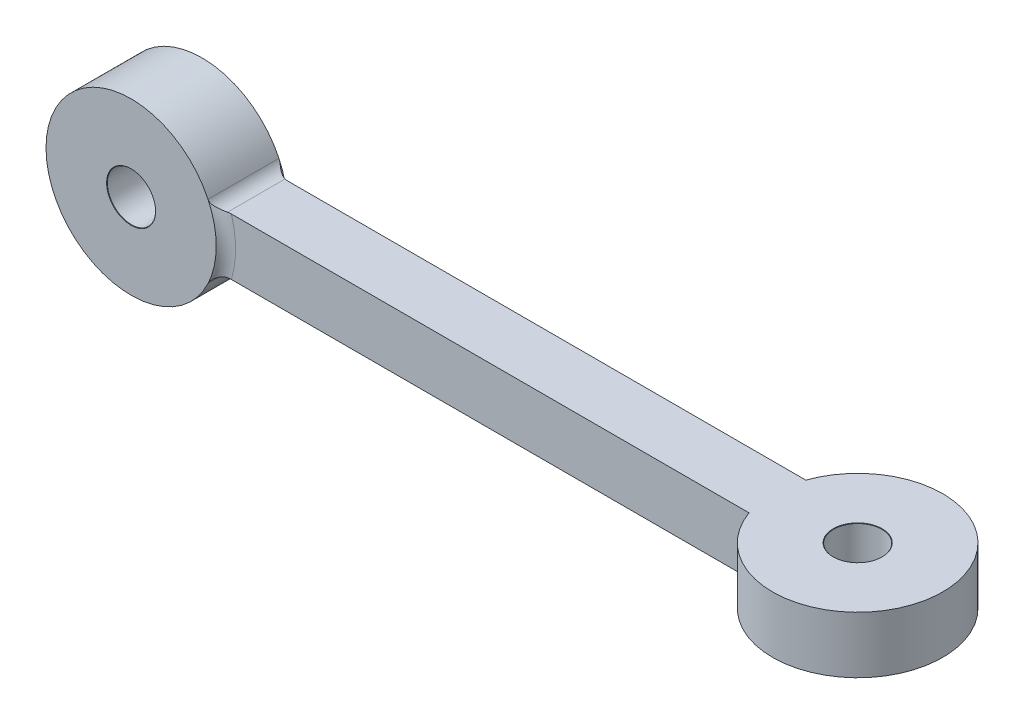
ISO-10303-21;
HEADER;
FILE_DESCRIPTION(('STEP AP214'),'2;1');
FILE_NAME('part.step','',(''),(''),'','','');
FILE_SCHEMA(('AUTOMOTIVE_DESIGN { 1 0 10303 214 1 1 1 1 }'));
ENDSEC;
DATA;
#1=APPLICATION_CONTEXT('core data for automotive mechanical design processes');
#2=APPLICATION_PROTOCOL_DEFINITION('international standard','automotive_design',2000,#1);
#3=PRODUCT_CONTEXT('',#1,'mechanical');
#4=PRODUCT('Part','Part','',(#3));
#5=PRODUCT_RELATED_PRODUCT_CATEGORY('part','',(#4));
#6=PRODUCT_DEFINITION_FORMATION('','',#4);
#7=PRODUCT_DEFINITION_CONTEXT('part definition',#1,'design');
#8=PRODUCT_DEFINITION('design','',#6,#7);
#9=PRODUCT_DEFINITION_SHAPE('','',#8);
#10=(LENGTH_UNIT() NAMED_UNIT(*) SI_UNIT(.MILLI.,.METRE.));
#11=(NAMED_UNIT(*) PLANE_ANGLE_UNIT() SI_UNIT($,.RADIAN.));
#12=(NAMED_UNIT(*) SI_UNIT($,.STERADIAN.) SOLID_ANGLE_UNIT());
#13=UNCERTAINTY_MEASURE_WITH_UNIT(LENGTH_MEASURE(1.E-05),#10,'distance_accuracy_value','');
#14=(GEOMETRIC_REPRESENTATION_CONTEXT(3) GLOBAL_UNCERTAINTY_ASSIGNED_CONTEXT((#13)) GLOBAL_UNIT_ASSIGNED_CONTEXT((#10,
#11,#12)) REPRESENTATION_CONTEXT('',''));
#15=CARTESIAN_POINT('',(0.,0.,0.));
#16=DIRECTION('',(0.,0.,1.));
#17=DIRECTION('',(1.,0.,0.));
#18=AXIS2_PLACEMENT_3D('',#15,#16,#17);
#19=CARTESIAN_POINT('',(-3.,0.,-4.5));
#20=DIRECTION('',(0.,0.,1.));
#21=DIRECTION('',(1.,0.,0.));
#22=AXIS2_PLACEMENT_3D('',#19,#20,#21);
#23=CYLINDRICAL_SURFACE('',#22,6.);
#24=CARTESIAN_POINT('',(-3.,0.,-4.5));
#25=DIRECTION('',(0.,0.,1.));
#26=DIRECTION('',(1.,0.,0.));
#27=AXIS2_PLACEMENT_3D('',#24,#25,#26);
#28=CIRCLE('',#27,6.);
#29=CARTESIAN_POINT('',(2.42104741743151,2.57142857142857,-4.5));
#30=VERTEX_POINT('',#29);
#31=CARTESIAN_POINT('',(2.42104741743151,-2.57142857142857,-4.5));
#32=VERTEX_POINT('',#31);
#33=EDGE_CURVE('E149',#30,#32,#28,.T.);
#34=ORIENTED_EDGE('',*,*,#33,.T.);
#35=DIRECTION('',(0.,0.,1.));
#36=VECTOR('',#35,1.);
#37=CARTESIAN_POINT('',(2.42104741743151,-2.57142857142857,-4.5));
#38=LINE('',#37,#36);
#39=CARTESIAN_POINT('',(2.42104741743151,-2.57142857142857,0.5));
#40=VERTEX_POINT('',#39);
#41=EDGE_CURVE('E154',#32,#40,#38,.T.);
#42=ORIENTED_EDGE('',*,*,#41,.T.);
#43=CARTESIAN_POINT('',(-3.,0.,0.5));
#44=DIRECTION('',(0.,0.,1.));
#45=DIRECTION('',(1.,0.,0.));
#46=AXIS2_PLACEMENT_3D('',#43,#44,#45);
#47=CIRCLE('',#46,6.);
#48=CARTESIAN_POINT('',(2.42104741743151,2.57142857142857,0.5));
#49=VERTEX_POINT('',#48);
#50=EDGE_CURVE('E145',#49,#40,#47,.T.);
#51=ORIENTED_EDGE('',*,*,#50,.F.);
#52=DIRECTION('',(0.,0.,1.));
#53=VECTOR('',#52,1.);
#54=CARTESIAN_POINT('',(2.42104741743151,2.57142857142857,-4.5));
#55=LINE('',#54,#53);
#56=EDGE_CURVE('E152',#49,#30,#55,.F.);
#57=ORIENTED_EDGE('',*,*,#56,.T.);
#58=EDGE_LOOP('',(#34,#42,#51,#57));
#59=FACE_BOUND('',#58,.T.);
#60=ADVANCED_FACE('F39',(#59),#23,.T.);
#61=CARTESIAN_POINT('',(-3.,0.,-4.5));
#62=DIRECTION('',(0.,0.,1.));
#63=DIRECTION('',(1.,0.,0.));
#64=AXIS2_PLACEMENT_3D('',#61,#62,#63);
#65=PLANE('',#64);
#66=CARTESIAN_POINT('',(-3.,0.,-4.5));
#67=DIRECTION('',(0.,0.,1.));
#68=DIRECTION('',(1.,0.,0.));
#69=AXIS2_PLACEMENT_3D('',#66,#67,#68);
#70=CIRCLE('',#69,1.7);
#71=CARTESIAN_POINT('',(-1.3,0.,-4.5));
#72=VERTEX_POINT('',#71);
#73=EDGE_CURVE('E208',#72,#72,#70,.T.);
#74=ORIENTED_EDGE('',*,*,#73,.T.);
#75=EDGE_LOOP('',(#74));
#76=FACE_BOUND('',#75,.T.);
#77=ORIENTED_EDGE('',*,*,#33,.F.);
#78=EDGE_CURVE('E148',#32,#30,#28,.T.);
#79=ORIENTED_EDGE('',*,*,#78,.F.);
#80=EDGE_LOOP('',(#77,#79));
#81=FACE_BOUND('',#80,.T.);
#82=ADVANCED_FACE('F241',(#76,#81),#65,.F.);
#83=CARTESIAN_POINT('',(-3.,0.,0.5));
#84=DIRECTION('',(0.,0.,1.));
#85=DIRECTION('',(1.,0.,0.));
#86=AXIS2_PLACEMENT_3D('',#83,#84,#85);
#87=PLANE('',#86);
#88=CARTESIAN_POINT('',(-3.,0.,0.5));
#89=DIRECTION('',(0.,0.,1.));
#90=DIRECTION('',(1.,0.,0.));
#91=AXIS2_PLACEMENT_3D('',#88,#89,#90);
#92=CIRCLE('',#91,1.725);
#93=CARTESIAN_POINT('',(-1.275,0.,0.5));
#94=VERTEX_POINT('',#93);
#95=EDGE_CURVE('E214',#94,#94,#92,.T.);
#96=ORIENTED_EDGE('',*,*,#95,.F.);
#97=EDGE_LOOP('',(#96));
#98=FACE_BOUND('',#97,.T.);
#99=ORIENTED_EDGE('',*,*,#50,.T.);
#100=EDGE_CURVE('E143',#40,#49,#47,.T.);
#101=ORIENTED_EDGE('',*,*,#100,.T.);
#102=EDGE_LOOP('',(#99,#101));
#103=FACE_BOUND('',#102,.T.);
#104=ADVANCED_FACE('F249',(#98,#103),#87,.T.);
#105=CARTESIAN_POINT('',(45.7195480052413,-2.,-2.));
#106=DIRECTION('',(0.,1.,0.));
#107=DIRECTION('',(0.,0.,1.));
#108=AXIS2_PLACEMENT_3D('',#105,#106,#107);
#109=CYLINDRICAL_SURFACE('',#108,6.);
#110=DIRECTION('',(0.,1.,0.));
#111=VECTOR('',#110,1.);
#112=CARTESIAN_POINT('',(40.0626937557489,-2.,-4.));
#113=LINE('',#112,#111);
#114=CARTESIAN_POINT('',(40.0626937557489,-2.,-4.));
#115=VERTEX_POINT('',#114);
#116=CARTESIAN_POINT('',(40.0626937557489,2.,-4.));
#117=VERTEX_POINT('',#116);
#118=EDGE_CURVE('E108',#115,#117,#113,.T.);
#119=ORIENTED_EDGE('',*,*,#118,.T.);
#120=CARTESIAN_POINT('',(45.7195480052413,2.,-2.));
#121=DIRECTION('',(0.,1.,0.));
#122=DIRECTION('',(0.,0.,1.));
#123=AXIS2_PLACEMENT_3D('',#120,#121,#122);
#124=CIRCLE('',#123,6.);
#125=CARTESIAN_POINT('',(40.0626937557489,2.,0.));
#126=VERTEX_POINT('',#125);
#127=EDGE_CURVE('E115',#126,#117,#124,.T.);
#128=ORIENTED_EDGE('',*,*,#127,.F.);
#129=DIRECTION('',(0.,1.,0.));
#130=VECTOR('',#129,1.);
#131=CARTESIAN_POINT('',(40.0626937557489,-2.,0.));
#132=LINE('',#131,#130);
#133=CARTESIAN_POINT('',(40.0626937557489,-2.,0.));
#134=VERTEX_POINT('',#133);
#135=EDGE_CURVE('E123',#134,#126,#132,.T.);
#136=ORIENTED_EDGE('',*,*,#135,.F.);
#137=CARTESIAN_POINT('',(45.7195480052413,-2.,-2.));
#138=DIRECTION('',(0.,1.,0.));
#139=DIRECTION('',(0.,0.,1.));
#140=AXIS2_PLACEMENT_3D('',#137,#138,#139);
#141=CIRCLE('',#140,6.);
#142=EDGE_CURVE('E122',#134,#115,#141,.T.);
#143=ORIENTED_EDGE('',*,*,#142,.T.);
#144=EDGE_LOOP('',(#119,#128,#136,#143));
#145=FACE_BOUND('',#144,.T.);
#146=ADVANCED_FACE('F119',(#145),#109,.T.);
#147=CARTESIAN_POINT('',(0.,-2.,0.));
#148=DIRECTION('',(0.,0.,1.));
#149=DIRECTION('',(1.,0.,0.));
#150=AXIS2_PLACEMENT_3D('',#147,#148,#149);
#151=PLANE('',#150);
#152=DIRECTION('',(1.,0.,0.));
#153=VECTOR('',#152,1.);
#154=CARTESIAN_POINT('',(0.,2.,0.));
#155=LINE('',#154,#153);
#156=CARTESIAN_POINT('',(3.56828020454466,2.,0.));
#157=VERTEX_POINT('',#156);
#158=EDGE_CURVE('E114',#157,#126,#155,.T.);
#159=ORIENTED_EDGE('',*,*,#158,.F.);
#160=CARTESIAN_POINT('',(-3.,0.,0.));
#161=DIRECTION('',(0.,0.,1.));
#162=DIRECTION('',(1.,0.,0.));
#163=AXIS2_PLACEMENT_3D('',#160,#161,#162);
#164=CIRCLE('',#163,6.86602540378444);
#165=CARTESIAN_POINT('',(3.56828020454466,-2.,0.));
#166=VERTEX_POINT('',#165);
#167=EDGE_CURVE('E161',#157,#166,#164,.F.);
#168=ORIENTED_EDGE('',*,*,#167,.T.);
#169=DIRECTION('',(1.,0.,0.));
#170=VECTOR('',#169,1.);
#171=CARTESIAN_POINT('',(0.,-2.,0.));
#172=LINE('',#171,#170);
#173=EDGE_CURVE('E124',#166,#134,#172,.T.);
#174=ORIENTED_EDGE('',*,*,#173,.T.);
#175=ORIENTED_EDGE('',*,*,#135,.T.);
#176=EDGE_LOOP('',(#159,#168,#174,#175));
#177=FACE_BOUND('',#176,.T.);
#178=ADVANCED_FACE('F289',(#177),#151,.T.);
#179=CARTESIAN_POINT('',(0.,-2.,-4.));
#180=DIRECTION('',(0.,0.,1.));
#181=DIRECTION('',(1.,0.,0.));
#182=AXIS2_PLACEMENT_3D('',#179,#180,#181);
#183=PLANE('',#182);
#184=DIRECTION('',(1.,0.,0.));
#185=VECTOR('',#184,1.);
#186=CARTESIAN_POINT('',(0.,-2.,-4.));
#187=LINE('',#186,#185);
#188=CARTESIAN_POINT('',(3.56828020454466,-2.,-4.));
#189=VERTEX_POINT('',#188);
#190=EDGE_CURVE('E140',#189,#115,#187,.T.);
#191=ORIENTED_EDGE('',*,*,#190,.F.);
#192=CARTESIAN_POINT('',(-3.,0.,-4.));
#193=DIRECTION('',(0.,0.,1.));
#194=DIRECTION('',(1.,0.,0.));
#195=AXIS2_PLACEMENT_3D('',#192,#193,#194);
#196=CIRCLE('',#195,6.86602540378444);
#197=CARTESIAN_POINT('',(3.56828020454466,2.,-4.));
#198=VERTEX_POINT('',#197);
#199=EDGE_CURVE('E111',#189,#198,#196,.T.);
#200=ORIENTED_EDGE('',*,*,#199,.T.);
#201=DIRECTION('',(1.,0.,0.));
#202=VECTOR('',#201,1.);
#203=CARTESIAN_POINT('',(0.,2.,-4.));
#204=LINE('',#203,#202);
#205=EDGE_CURVE('E104',#198,#117,#204,.T.);
#206=ORIENTED_EDGE('',*,*,#205,.T.);
#207=ORIENTED_EDGE('',*,*,#118,.F.);
#208=EDGE_LOOP('',(#191,#200,#206,#207));
#209=FACE_BOUND('',#208,.T.);
#210=ADVANCED_FACE('F107',(#209),#183,.F.);
#211=CARTESIAN_POINT('',(0.,-2.,0.));
#212=DIRECTION('',(0.,1.,0.));
#213=DIRECTION('',(0.,0.,1.));
#214=AXIS2_PLACEMENT_3D('',#211,#212,#213);
#215=PLANE('',#214);
#216=CARTESIAN_POINT('',(45.7195480052413,-2.,-2.));
#217=DIRECTION('',(0.,1.,0.));
#218=DIRECTION('',(0.,0.,1.));
#219=AXIS2_PLACEMENT_3D('',#216,#217,#218);
#220=CIRCLE('',#219,1.69999999999999);
#221=CARTESIAN_POINT('',(45.7195480052413,-2.,-0.300000000000007));
#222=VERTEX_POINT('',#221);
#223=EDGE_CURVE('E44',#222,#222,#220,.T.);
#224=ORIENTED_EDGE('',*,*,#223,.T.);
#225=EDGE_LOOP('',(#224));
#226=FACE_BOUND('',#225,.T.);
#227=ORIENTED_EDGE('',*,*,#173,.F.);
#228=CARTESIAN_POINT('',(3.56828020454466,-2.,0.));
#229=CARTESIAN_POINT('',(3.52714517806251,-2.,1.7825944556333E-05));
#230=CARTESIAN_POINT('',(3.48626715233828,-2.,0.00231589468487027));
#231=CARTESIAN_POINT('',(3.40502552967545,-2.,0.0114724696003244));
#232=CARTESIAN_POINT('',(3.36466192733037,-2.,0.018330927806529));
#233=CARTESIAN_POINT('',(3.32455532033676,-2.,0.0274695808395556));
#234=B_SPLINE_CURVE_WITH_KNOTS('',3,(#228,#229,#230,#231,#232,#233),.UNSPECIFIED.,.F.,.F.,(4,2,
4),(0.,0.122827712522096,0.245654133088434),.UNSPECIFIED.);
#235=CARTESIAN_POINT('',(3.32455532033676,-2.,0.0274695808395556));
#236=VERTEX_POINT('',#235);
#237=EDGE_CURVE('E49',#166,#236,#234,.T.);
#238=ORIENTED_EDGE('',*,*,#237,.T.);
#239=DIRECTION('',(0.,0.,1.));
#240=VECTOR('',#239,1.);
#241=CARTESIAN_POINT('',(3.32455532033676,-2.,0.));
#242=LINE('',#241,#240);
#243=CARTESIAN_POINT('',(3.32455532033676,-2.,-4.02746958083956));
#244=VERTEX_POINT('',#243);
#245=EDGE_CURVE('E157',#236,#244,#242,.F.);
#246=ORIENTED_EDGE('',*,*,#245,.T.);
#247=CARTESIAN_POINT('',(3.32455532033676,-2.,-4.02746958083956));
#248=CARTESIAN_POINT('',(3.36466192733037,-2.,-4.01833092780653));
#249=CARTESIAN_POINT('',(3.40502552967545,-2.,-4.01147246960032));
#250=CARTESIAN_POINT('',(3.48626715233828,-2.,-4.00231589468487));
#251=CARTESIAN_POINT('',(3.52714517806251,-2.,-4.00001782594456));
#252=CARTESIAN_POINT('',(3.56828020454466,-2.,-4.));
#253=B_SPLINE_CURVE_WITH_KNOTS('',3,(#247,#248,#249,#250,#251,#252),.UNSPECIFIED.,.F.,.F.,(4,2,
4),(0.,0.122826420566338,0.245654133088434),.UNSPECIFIED.);
#254=EDGE_CURVE('E163',#244,#189,#253,.T.);
#255=ORIENTED_EDGE('',*,*,#254,.T.);
#256=ORIENTED_EDGE('',*,*,#190,.T.);
#257=ORIENTED_EDGE('',*,*,#142,.F.);
#258=EDGE_LOOP('',(#227,#238,#246,#255,#256,#257));
#259=FACE_BOUND('',#258,.T.);
#260=ADVANCED_FACE('F177',(#226,#259),#215,.F.);
#261=CARTESIAN_POINT('',(0.,2.,0.));
#262=DIRECTION('',(0.,1.,0.));
#263=DIRECTION('',(0.,0.,1.));
#264=AXIS2_PLACEMENT_3D('',#261,#262,#263);
#265=PLANE('',#264);
#266=CARTESIAN_POINT('',(45.7195480052413,2.,-2.));
#267=DIRECTION('',(0.,1.,0.));
#268=DIRECTION('',(0.,0.,1.));
#269=AXIS2_PLACEMENT_3D('',#266,#267,#268);
#270=CIRCLE('',#269,1.725);
#271=CARTESIAN_POINT('',(45.7195480052413,2.,-0.274999999999996));
#272=VERTEX_POINT('',#271);
#273=EDGE_CURVE('E225',#272,#272,#270,.T.);
#274=ORIENTED_EDGE('',*,*,#273,.F.);
#275=EDGE_LOOP('',(#274));
#276=FACE_BOUND('',#275,.T.);
#277=CARTESIAN_POINT('',(3.56828020454466,2.,-4.));
#278=CARTESIAN_POINT('',(3.52714517806251,2.,-4.00001782594456));
#279=CARTESIAN_POINT('',(3.48626715233828,2.,-4.00231589468487));
#280=CARTESIAN_POINT('',(3.40502552967545,2.,-4.01147246960032));
#281=CARTESIAN_POINT('',(3.36466192733037,2.,-4.01833092780653));
#282=CARTESIAN_POINT('',(3.32455532033676,2.,-4.02746958083956));
#283=B_SPLINE_CURVE_WITH_KNOTS('',3,(#277,#278,#279,#280,#281,#282),.UNSPECIFIED.,.F.,.F.,(4,2,
4),(0.,0.122827712522096,0.245654133088434),.UNSPECIFIED.);
#284=CARTESIAN_POINT('',(3.32455532033676,2.,-4.02746958083956));
#285=VERTEX_POINT('',#284);
#286=EDGE_CURVE('E170',#198,#285,#283,.T.);
#287=ORIENTED_EDGE('',*,*,#286,.T.);
#288=DIRECTION('',(0.,0.,-1.));
#289=VECTOR('',#288,1.);
#290=CARTESIAN_POINT('',(3.32455532033676,2.,0.));
#291=LINE('',#290,#289);
#292=CARTESIAN_POINT('',(3.32455532033676,2.,0.0274695808395556));
#293=VERTEX_POINT('',#292);
#294=EDGE_CURVE('E56',#285,#293,#291,.F.);
#295=ORIENTED_EDGE('',*,*,#294,.T.);
#296=CARTESIAN_POINT('',(3.32455532033676,2.,0.0274695808395556));
#297=CARTESIAN_POINT('',(3.36466192733037,2.,0.018330927806529));
#298=CARTESIAN_POINT('',(3.40502552967545,2.,0.0114724696003244));
#299=CARTESIAN_POINT('',(3.48626715233828,2.,0.00231589468487031));
#300=CARTESIAN_POINT('',(3.52714517806251,2.,1.7825944556382E-05));
#301=CARTESIAN_POINT('',(3.56828020454466,2.,0.));
#302=B_SPLINE_CURVE_WITH_KNOTS('',3,(#296,#297,#298,#299,#300,#301),.UNSPECIFIED.,.F.,.F.,(4,2,
4),(0.,0.122826420566339,0.245654133088434),.UNSPECIFIED.);
#303=EDGE_CURVE('E11',#293,#157,#302,.T.);
#304=ORIENTED_EDGE('',*,*,#303,.T.);
#305=ORIENTED_EDGE('',*,*,#158,.T.);
#306=ORIENTED_EDGE('',*,*,#127,.T.);
#307=ORIENTED_EDGE('',*,*,#205,.F.);
#308=EDGE_LOOP('',(#287,#295,#304,#305,#306,#307));
#309=FACE_BOUND('',#308,.T.);
#310=ADVANCED_FACE('F126',(#276,#309),#265,.T.);
#311=CARTESIAN_POINT('',(3.32455532033676,3.,-4.5));
#312=DIRECTION('',(0.,0.,1.));
#313=DIRECTION('',(1.,0.,0.));
#314=AXIS2_PLACEMENT_3D('',#311,#312,#313);
#315=CYLINDRICAL_SURFACE('',#314,1.);
#316=ORIENTED_EDGE('',*,*,#294,.F.);
#317=CARTESIAN_POINT('',(3.32455532033676,2.,-4.02746958083956));
#318=CARTESIAN_POINT('',(3.26985460821495,1.99999600723882,-4.03991120419553));
#319=CARTESIAN_POINT('',(3.21641795985069,2.00447805248222,-4.05623229895358));
#320=CARTESIAN_POINT('',(3.11341656948192,2.02117061066505,-4.09448323370875));
#321=CARTESIAN_POINT('',(3.06381893759329,2.03330474025819,-4.11635637826727));
#322=CARTESIAN_POINT('',(2.95712534976834,2.06786328129808,-4.16968407495627));
#323=CARTESIAN_POINT('',(2.90115475890428,2.09207665579006,-4.20217411258844));
#324=CARTESIAN_POINT('',(2.79536302649746,2.14935375855813,-4.26967682365392));
#325=CARTESIAN_POINT('',(2.74556477655801,2.18244907164915,-4.30469816735668));
#326=CARTESIAN_POINT('',(2.67100779140413,2.24228546119416,-4.35885475273483));
#327=CARTESIAN_POINT('',(2.6443317114544,2.26609776806166,-4.37863427777704));
#328=CARTESIAN_POINT('',(2.59295971155664,2.31729837136952,-4.41602302395071));
#329=CARTESIAN_POINT('',(2.56826032606977,2.34468017781432,-4.43363607381978));
#330=CARTESIAN_POINT('',(2.52710737162618,2.39596346257177,-4.46035624201857));
#331=CARTESIAN_POINT('',(2.51017435765578,2.41893104888385,-4.47048498197204));
#332=CARTESIAN_POINT('',(2.47783385489848,2.46718438350525,-4.48674380542626));
#333=CARTESIAN_POINT('',(2.46241993648683,2.49245940454921,-4.49289141516045));
#334=CARTESIAN_POINT('',(2.43856357863748,2.53586992831241,-4.49881861252471));
#335=CARTESIAN_POINT('',(2.42953692313785,2.55349897105883,-4.5000552825405));
#336=CARTESIAN_POINT('',(2.42104741743151,2.57142857142857,-4.5));
#337=B_SPLINE_CURVE_WITH_KNOTS('',3,(#317,#318,#319,#320,#321,#322,#323,#324,#325,#326,#327,
#328,#329,#330,#331,#332,#333,#334,#335,#336),.UNSPECIFIED.,.F.,.F.,(4,2,2,2,2,2,2,2,2,4),(0.,
0.167431844372794,0.333218274675315,0.539477541273178,0.746480229101894,0.868904448994514,
0.991109105643095,1.08167991086313,1.17184923344781,1.23125269057857),.UNSPECIFIED.);
#338=EDGE_CURVE('E129',#30,#285,#337,.F.);
#339=ORIENTED_EDGE('',*,*,#338,.F.);
#340=ORIENTED_EDGE('',*,*,#56,.F.);
#341=CARTESIAN_POINT('',(3.32455532033676,2.,0.0274695808395556));
#342=CARTESIAN_POINT('',(3.26985460821495,1.99999600723882,0.0399112041955306));
#343=CARTESIAN_POINT('',(3.21641795985069,2.00447805248222,0.0562322989535786));
#344=CARTESIAN_POINT('',(3.11341656948192,2.02117061066505,0.094483233708749));
#345=CARTESIAN_POINT('',(3.06381893759329,2.03330474025819,0.116356378267271));
#346=CARTESIAN_POINT('',(2.95712534976834,2.06786328129808,0.169684074956268));
#347=CARTESIAN_POINT('',(2.90115475890428,2.09207665579006,0.202174112588442));
#348=CARTESIAN_POINT('',(2.79536302649746,2.14935375855813,0.269676823653924));
#349=CARTESIAN_POINT('',(2.74556477655801,2.18244907164915,0.304698167356679));
#350=CARTESIAN_POINT('',(2.67100779140413,2.24228546119416,0.35885475273483));
#351=CARTESIAN_POINT('',(2.6443317114544,2.26609776806166,0.378634277777042));
#352=CARTESIAN_POINT('',(2.59295971155664,2.31729837136952,0.416023023950706));
#353=CARTESIAN_POINT('',(2.56826032606977,2.34468017781432,0.43363607381978));
#354=CARTESIAN_POINT('',(2.52710737162618,2.39596346257177,0.460356242018568));
#355=CARTESIAN_POINT('',(2.51017435765578,2.41893104888385,0.470484981972038));
#356=CARTESIAN_POINT('',(2.47783385489847,2.46718438350525,0.486743805426263));
#357=CARTESIAN_POINT('',(2.46241993648683,2.49245940454922,0.492891415160447));
#358=CARTESIAN_POINT('',(2.43856357863748,2.53586992831241,0.498818612524706));
#359=CARTESIAN_POINT('',(2.42953692313785,2.55349897105883,0.500055282540503));
#360=CARTESIAN_POINT('',(2.42104741743151,2.57142857142857,0.499999999999999));
#361=B_SPLINE_CURVE_WITH_KNOTS('',3,(#341,#342,#343,#344,#345,#346,#347,#348,#349,#350,#351,
#352,#353,#354,#355,#356,#357,#358,#359,#360),.UNSPECIFIED.,.F.,.F.,(4,2,2,2,2,2,2,2,2,4),(0.,
0.167431844372794,0.333218274675316,0.539477541273177,0.746480229101894,0.868904448994515,
0.991109105643096,1.08167991086313,1.17184923344781,1.23125269057857),.UNSPECIFIED.);
#362=EDGE_CURVE('E132',#293,#49,#361,.T.);
#363=ORIENTED_EDGE('',*,*,#362,.F.);
#364=EDGE_LOOP('',(#316,#339,#340,#363));
#365=FACE_BOUND('',#364,.T.);
#366=ADVANCED_FACE('F41',(#365),#315,.F.);
#367=CARTESIAN_POINT('',(-3.,0.,-5.));
#368=DIRECTION('',(0.,0.,1.));
#369=DIRECTION('',(1.,0.,0.));
#370=AXIS2_PLACEMENT_3D('',#367,#368,#369);
#371=TOROIDAL_SURFACE('',#370,6.86602540378444,1.);
#372=ORIENTED_EDGE('',*,*,#199,.F.);
#373=ORIENTED_EDGE('',*,*,#254,.F.);
#374=CARTESIAN_POINT('',(3.32455532033676,-2.,-4.02746958083956));
#375=CARTESIAN_POINT('',(3.26985460821495,-1.99999600723882,-4.03991120419553));
#376=CARTESIAN_POINT('',(3.21641795985069,-2.00447805248222,-4.05623229895358));
#377=CARTESIAN_POINT('',(3.11341656948192,-2.02117061066505,-4.09448323370875));
#378=CARTESIAN_POINT('',(3.06381893759329,-2.03330474025819,-4.11635637826727));
#379=CARTESIAN_POINT('',(2.95712534976834,-2.06786328129808,-4.16968407495627));
#380=CARTESIAN_POINT('',(2.90115475890428,-2.09207665579006,-4.20217411258844));
#381=CARTESIAN_POINT('',(2.79536302649746,-2.14935375855813,-4.26967682365392));
#382=CARTESIAN_POINT('',(2.74556477655801,-2.18244907164915,-4.30469816735668));
#383=CARTESIAN_POINT('',(2.67100779140413,-2.24228546119416,-4.35885475273483));
#384=CARTESIAN_POINT('',(2.6443317114544,-2.26609776806166,-4.37863427777704));
#385=CARTESIAN_POINT('',(2.59295971155664,-2.31729837136952,-4.41602302395071));
#386=CARTESIAN_POINT('',(2.56826032606977,-2.34468017781432,-4.43363607381978));
#387=CARTESIAN_POINT('',(2.52710737162618,-2.39596346257177,-4.46035624201857));
#388=CARTESIAN_POINT('',(2.51017435765578,-2.41893104888385,-4.47048498197204));
#389=CARTESIAN_POINT('',(2.47783385489848,-2.46718438350525,-4.48674380542626));
#390=CARTESIAN_POINT('',(2.46241993648683,-2.49245940454921,-4.49289141516045));
#391=CARTESIAN_POINT('',(2.43856357863748,-2.53586992831241,-4.49881861252471));
#392=CARTESIAN_POINT('',(2.42953692313785,-2.55349897105882,-4.5000552825405));
#393=CARTESIAN_POINT('',(2.42104741743151,-2.57142857142857,-4.5));
#394=B_SPLINE_CURVE_WITH_KNOTS('',3,(#374,#375,#376,#377,#378,#379,#380,#381,#382,#383,#384,
#385,#386,#387,#388,#389,#390,#391,#392,#393),.UNSPECIFIED.,.F.,.F.,(4,2,2,2,2,2,2,2,2,4),(0.,
0.167431844372794,0.333218274675315,0.539477541273178,0.746480229101894,0.868904448994514,
0.991109105643095,1.08167991086313,1.17184923344781,1.23125269057857),.UNSPECIFIED.);
#395=EDGE_CURVE('E192',#32,#244,#394,.F.);
#396=ORIENTED_EDGE('',*,*,#395,.F.);
#397=ORIENTED_EDGE('',*,*,#78,.T.);
#398=ORIENTED_EDGE('',*,*,#338,.T.);
#399=ORIENTED_EDGE('',*,*,#286,.F.);
#400=EDGE_LOOP('',(#372,#373,#396,#397,#398,#399));
#401=FACE_BOUND('',#400,.T.);
#402=ADVANCED_FACE('F180',(#401),#371,.F.);
#403=CARTESIAN_POINT('',(-3.,0.,1.));
#404=DIRECTION('',(0.,0.,1.));
#405=DIRECTION('',(1.,0.,0.));
#406=AXIS2_PLACEMENT_3D('',#403,#404,#405);
#407=TOROIDAL_SURFACE('',#406,6.86602540378444,1.);
#408=ORIENTED_EDGE('',*,*,#362,.T.);
#409=ORIENTED_EDGE('',*,*,#100,.F.);
#410=CARTESIAN_POINT('',(2.42104741743151,-2.57142857142857,0.5));
#411=CARTESIAN_POINT('',(2.43444235583409,-2.54311543607816,0.500147891067659));
#412=CARTESIAN_POINT('',(2.44910149632135,-2.51571008482877,0.497021304335098));
#413=CARTESIAN_POINT('',(2.4800603798107,-2.4636149452758,0.485844183432259));
#414=CARTESIAN_POINT('',(2.49632164597598,-2.4388819527666,0.477892927725156));
#415=CARTESIAN_POINT('',(2.53900061323712,-2.37962318175619,0.453541918578621));
#416=CARTESIAN_POINT('',(2.56629381079778,-2.34671369173216,0.434898746490255));
#417=CARTESIAN_POINT('',(2.62373880806109,-2.28540781292076,0.393862220644741));
#418=CARTESIAN_POINT('',(2.65392293870937,-2.25707511174043,0.371423596750836));
#419=CARTESIAN_POINT('',(2.71006517159797,-2.21042919167184,0.330412037677058));
#420=CARTESIAN_POINT('',(2.73550202175033,-2.19128032954998,0.312068093114133));
#421=CARTESIAN_POINT('',(2.78809448869482,-2.15547499875397,0.275407294544309));
#422=CARTESIAN_POINT('',(2.81525089586131,-2.1388196882196,0.257090457013707));
#423=CARTESIAN_POINT('',(2.89895091660209,-2.09286480658032,0.203399076225085));
#424=CARTESIAN_POINT('',(2.95819080610298,-2.06718821714221,0.16891699549439));
#425=CARTESIAN_POINT('',(3.06779370622178,-2.03228441030739,0.114559858685652));
#426=CARTESIAN_POINT('',(3.11659707211767,-2.02053681941444,0.0931982323111391));
#427=CARTESIAN_POINT('',(3.21801422590825,-2.00434525690984,0.0557507724091536));
#428=CARTESIAN_POINT('',(3.27066868713566,-1.99999638743681,0.0397357324046067));
#429=CARTESIAN_POINT('',(3.32455532033676,-2.,0.0274695808395551));
#430=B_SPLINE_CURVE_WITH_KNOTS('',3,(#410,#411,#412,#413,#414,#415,#416,#417,#418,#419,#420,
#421,#422,#423,#424,#425,#426,#427,#428,#429),.UNSPECIFIED.,.F.,.F.,(4,2,2,2,2,2,2,2,2,4),(0.,
0.0933364697196764,0.184814549956345,0.323980072406457,0.464940625916323,0.57504506513364,
0.685200485193114,0.903410563817515,1.06627299631806,1.23121345154349),.UNSPECIFIED.);
#431=EDGE_CURVE('E210',#236,#40,#430,.F.);
#432=ORIENTED_EDGE('',*,*,#431,.F.);
#433=ORIENTED_EDGE('',*,*,#237,.F.);
#434=ORIENTED_EDGE('',*,*,#167,.F.);
#435=ORIENTED_EDGE('',*,*,#303,.F.);
#436=EDGE_LOOP('',(#408,#409,#432,#433,#434,#435));
#437=FACE_BOUND('',#436,.T.);
#438=ADVANCED_FACE('F184',(#437),#407,.F.);
#439=CARTESIAN_POINT('',(3.32455532033676,-3.,-4.5));
#440=DIRECTION('',(0.,0.,1.));
#441=DIRECTION('',(1.,0.,0.));
#442=AXIS2_PLACEMENT_3D('',#439,#440,#441);
#443=CYLINDRICAL_SURFACE('',#442,1.);
#444=ORIENTED_EDGE('',*,*,#395,.T.);
#445=ORIENTED_EDGE('',*,*,#245,.F.);
#446=ORIENTED_EDGE('',*,*,#431,.T.);
#447=ORIENTED_EDGE('',*,*,#41,.F.);
#448=EDGE_LOOP('',(#444,#445,#446,#447));
#449=FACE_BOUND('',#448,.T.);
#450=ADVANCED_FACE('F186',(#449),#443,.F.);
#451=CARTESIAN_POINT('',(-3.,0.,0.5));
#452=DIRECTION('',(0.,0.,1.));
#453=DIRECTION('',(1.,0.,0.));
#454=AXIS2_PLACEMENT_3D('',#451,#452,#453);
#455=CYLINDRICAL_SURFACE('',#454,1.7);
#456=CARTESIAN_POINT('',(-3.,0.,0.474999999999999));
#457=DIRECTION('',(0.,0.,1.));
#458=DIRECTION('',(1.,0.,0.));
#459=AXIS2_PLACEMENT_3D('',#456,#457,#458);
#460=CIRCLE('',#459,1.7);
#461=CARTESIAN_POINT('',(-1.3,0.,0.474999999999999));
#462=VERTEX_POINT('',#461);
#463=EDGE_CURVE('E135',#462,#462,#460,.T.);
#464=ORIENTED_EDGE('',*,*,#463,.T.);
#465=EDGE_LOOP('',(#464));
#466=FACE_BOUND('',#465,.T.);
#467=ORIENTED_EDGE('',*,*,#73,.F.);
#468=EDGE_LOOP('',(#467));
#469=FACE_BOUND('',#468,.T.);
#470=ADVANCED_FACE('F309',(#466,#469),#455,.F.);
#471=CARTESIAN_POINT('',(-3.,0.,0.5));
#472=DIRECTION('',(0.,0.,1.));
#473=DIRECTION('',(1.,0.,0.));
#474=AXIS2_PLACEMENT_3D('',#471,#472,#473);
#475=CONICAL_SURFACE('',#474,1.725,0.785398163397438);
#476=ORIENTED_EDGE('',*,*,#463,.F.);
#477=EDGE_LOOP('',(#476));
#478=FACE_BOUND('',#477,.T.);
#479=ORIENTED_EDGE('',*,*,#95,.T.);
#480=EDGE_LOOP('',(#479));
#481=FACE_BOUND('',#480,.T.);
#482=ADVANCED_FACE('F313',(#478,#481),#475,.F.);
#483=CARTESIAN_POINT('',(45.7195480052413,2.,-2.));
#484=DIRECTION('',(0.,1.,0.));
#485=DIRECTION('',(0.,0.,1.));
#486=AXIS2_PLACEMENT_3D('',#483,#484,#485);
#487=CYLINDRICAL_SURFACE('',#486,1.69999999999999);
#488=CARTESIAN_POINT('',(45.7195480052413,1.97499999999997,-2.));
#489=DIRECTION('',(0.,1.,0.));
#490=DIRECTION('',(0.,0.,1.));
#491=AXIS2_PLACEMENT_3D('',#488,#489,#490);
#492=CIRCLE('',#491,1.69999999999999);
#493=CARTESIAN_POINT('',(45.7195480052413,1.97499999999997,-0.300000000000014));
#494=VERTEX_POINT('',#493);
#495=EDGE_CURVE('E221',#494,#494,#492,.T.);
#496=ORIENTED_EDGE('',*,*,#495,.T.);
#497=EDGE_LOOP('',(#496));
#498=FACE_BOUND('',#497,.T.);
#499=ORIENTED_EDGE('',*,*,#223,.F.);
#500=EDGE_LOOP('',(#499));
#501=FACE_BOUND('',#500,.T.);
#502=ADVANCED_FACE('F320',(#498,#501),#487,.F.);
#503=CARTESIAN_POINT('',(45.7195480052413,2.,-2.));
#504=DIRECTION('',(0.,1.,0.));
#505=DIRECTION('',(0.,0.,1.));
#506=AXIS2_PLACEMENT_3D('',#503,#504,#505);
#507=CONICAL_SURFACE('',#506,1.725,0.785398163397275);
#508=ORIENTED_EDGE('',*,*,#495,.F.);
#509=EDGE_LOOP('',(#508));
#510=FACE_BOUND('',#509,.T.);
#511=ORIENTED_EDGE('',*,*,#273,.T.);
#512=EDGE_LOOP('',(#511));
#513=FACE_BOUND('',#512,.T.);
#514=ADVANCED_FACE('F229',(#510,#513),#507,.F.);
#515=CLOSED_SHELL('',(#60,#82,#104,#146,#178,#210,#260,#310,#366,#402,#438,#450,#470,#482,#502,#514));
#516=MANIFOLD_SOLID_BREP('B2',#515);
#517=ADVANCED_BREP_SHAPE_REPRESENTATION('',(#18,#516),#14);
#518=SHAPE_DEFINITION_REPRESENTATION(#9,#517);
ENDSEC;
END-ISO-10303-21;
